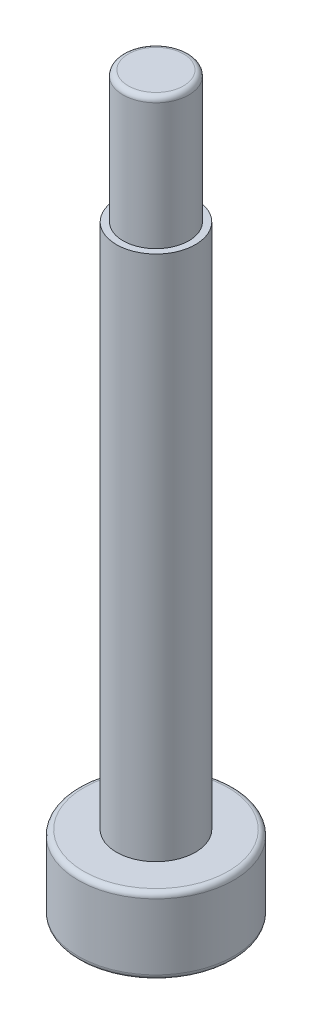
ISO-10303-21;
HEADER;
FILE_DESCRIPTION(('STEP AP214'),'2;1');
FILE_NAME('part.step','',(''),(''),'','','');
FILE_SCHEMA(('AUTOMOTIVE_DESIGN { 1 0 10303 214 1 1 1 1 }'));
ENDSEC;
DATA;
#1=APPLICATION_CONTEXT('core data for automotive mechanical design processes');
#2=APPLICATION_PROTOCOL_DEFINITION('international standard','automotive_design',2000,#1);
#3=PRODUCT_CONTEXT('',#1,'mechanical');
#4=PRODUCT('Part','Part','',(#3));
#5=PRODUCT_RELATED_PRODUCT_CATEGORY('part','',(#4));
#6=PRODUCT_DEFINITION_FORMATION('','',#4);
#7=PRODUCT_DEFINITION_CONTEXT('part definition',#1,'design');
#8=PRODUCT_DEFINITION('design','',#6,#7);
#9=PRODUCT_DEFINITION_SHAPE('','',#8);
#10=(LENGTH_UNIT() NAMED_UNIT(*) SI_UNIT(.MILLI.,.METRE.));
#11=(NAMED_UNIT(*) PLANE_ANGLE_UNIT() SI_UNIT($,.RADIAN.));
#12=(NAMED_UNIT(*) SI_UNIT($,.STERADIAN.) SOLID_ANGLE_UNIT());
#13=UNCERTAINTY_MEASURE_WITH_UNIT(LENGTH_MEASURE(1.E-05),#10,'distance_accuracy_value','');
#14=(GEOMETRIC_REPRESENTATION_CONTEXT(3) GLOBAL_UNCERTAINTY_ASSIGNED_CONTEXT((#13)) GLOBAL_UNIT_ASSIGNED_CONTEXT((#10,
#11,#12)) REPRESENTATION_CONTEXT('',''));
#15=CARTESIAN_POINT('',(0.,0.,0.));
#16=DIRECTION('',(0.,0.,1.));
#17=DIRECTION('',(1.,0.,0.));
#18=AXIS2_PLACEMENT_3D('',#15,#16,#17);
#19=CARTESIAN_POINT('',(0.,2.9,0.));
#20=DIRECTION('',(0.,-1.,0.));
#21=DIRECTION('',(0.,0.,-1.));
#22=AXIS2_PLACEMENT_3D('',#19,#20,#21);
#23=CYLINDRICAL_SURFACE('',#22,2.95);
#24=CARTESIAN_POINT('',(0.,0.2,0.));
#25=DIRECTION('',(0.,1.,0.));
#26=DIRECTION('',(0.,0.,1.));
#27=AXIS2_PLACEMENT_3D('',#24,#25,#26);
#28=CIRCLE('',#27,2.95);
#29=CARTESIAN_POINT('',(0.,0.2,2.95));
#30=VERTEX_POINT('',#29);
#31=EDGE_CURVE('E179',#30,#30,#28,.T.);
#32=ORIENTED_EDGE('',*,*,#31,.T.);
#33=EDGE_LOOP('',(#32));
#34=FACE_BOUND('',#33,.T.);
#35=CARTESIAN_POINT('',(0.,2.7,0.));
#36=DIRECTION('',(0.,1.,0.));
#37=DIRECTION('',(0.,0.,1.));
#38=AXIS2_PLACEMENT_3D('',#35,#36,#37);
#39=CIRCLE('',#38,2.95);
#40=CARTESIAN_POINT('',(0.,2.7,2.95));
#41=VERTEX_POINT('',#40);
#42=EDGE_CURVE('E168',#41,#41,#39,.F.);
#43=ORIENTED_EDGE('',*,*,#42,.T.);
#44=EDGE_LOOP('',(#43));
#45=FACE_BOUND('',#44,.T.);
#46=ADVANCED_FACE('F39',(#34,#45),#23,.T.);
#47=CARTESIAN_POINT('',(0.,2.9,0.));
#48=DIRECTION('',(0.,1.,0.));
#49=DIRECTION('',(0.,0.,1.));
#50=AXIS2_PLACEMENT_3D('',#47,#48,#49);
#51=PLANE('',#50);
#52=CARTESIAN_POINT('',(0.,2.9,0.));
#53=DIRECTION('',(0.,1.,0.));
#54=DIRECTION('',(0.,0.,1.));
#55=AXIS2_PLACEMENT_3D('',#52,#53,#54);
#56=CIRCLE('',#55,2.75);
#57=CARTESIAN_POINT('',(0.,2.9,2.75));
#58=VERTEX_POINT('',#57);
#59=EDGE_CURVE('E187',#58,#58,#56,.T.);
#60=ORIENTED_EDGE('',*,*,#59,.T.);
#61=EDGE_LOOP('',(#60));
#62=FACE_BOUND('',#61,.T.);
#63=CARTESIAN_POINT('',(0.,2.9,0.));
#64=DIRECTION('',(0.,1.,0.));
#65=DIRECTION('',(0.,0.,1.));
#66=AXIS2_PLACEMENT_3D('',#63,#64,#65);
#67=CIRCLE('',#66,1.5);
#68=CARTESIAN_POINT('',(0.,2.9,1.5));
#69=VERTEX_POINT('',#68);
#70=EDGE_CURVE('E169',#69,#69,#67,.T.);
#71=ORIENTED_EDGE('',*,*,#70,.F.);
#72=EDGE_LOOP('',(#71));
#73=FACE_BOUND('',#72,.T.);
#74=ADVANCED_FACE('F206',(#62,#73),#51,.T.);
#75=CARTESIAN_POINT('',(0.,0.,0.));
#76=DIRECTION('',(0.,1.,0.));
#77=DIRECTION('',(0.,0.,1.));
#78=AXIS2_PLACEMENT_3D('',#75,#76,#77);
#79=PLANE('',#78);
#80=CARTESIAN_POINT('',(0.,0.,0.));
#81=DIRECTION('',(0.,1.,0.));
#82=DIRECTION('',(0.,0.,1.));
#83=AXIS2_PLACEMENT_3D('',#80,#81,#82);
#84=CIRCLE('',#83,2.75);
#85=CARTESIAN_POINT('',(0.,0.,2.75));
#86=VERTEX_POINT('',#85);
#87=EDGE_CURVE('E183',#86,#86,#84,.F.);
#88=ORIENTED_EDGE('',*,*,#87,.T.);
#89=EDGE_LOOP('',(#88));
#90=FACE_BOUND('',#89,.T.);
#91=DIRECTION('',(-0.28704549437819,0.,0.95791695055322));
#92=VECTOR('',#91,1.);
#93=CARTESIAN_POINT('',(2.24728548800427,0.,-0.532016229770034));
#94=LINE('',#93,#92);
#95=CARTESIAN_POINT('',(2.24728548800427,0.,-0.532016229770034));
#96=VERTEX_POINT('',#95);
#97=CARTESIAN_POINT('',(1.58438231420861,0.,1.68019820728279));
#98=VERTEX_POINT('',#97);
#99=EDGE_CURVE('E135',#96,#98,#94,.T.);
#100=ORIENTED_EDGE('',*,*,#99,.F.);
#101=DIRECTION('',(0.686057666705715,0.,0.727547165449986));
#102=VECTOR('',#101,1.);
#103=CARTESIAN_POINT('',(0.662903173795668,0.,-2.21221443705283));
#104=LINE('',#103,#102);
#105=CARTESIAN_POINT('',(0.662903173795668,0.,-2.21221443705283));
#106=VERTEX_POINT('',#105);
#107=EDGE_CURVE('E55',#106,#96,#104,.T.);
#108=ORIENTED_EDGE('',*,*,#107,.F.);
#109=DIRECTION('',(0.973103161083906,0.,-0.230369785103234));
#110=VECTOR('',#109,1.);
#111=CARTESIAN_POINT('',(-1.58438231420861,0.,-1.68019820728279));
#112=LINE('',#111,#110);
#113=CARTESIAN_POINT('',(-1.58438231420861,0.,-1.68019820728279));
#114=VERTEX_POINT('',#113);
#115=EDGE_CURVE('E148',#114,#106,#112,.T.);
#116=ORIENTED_EDGE('',*,*,#115,.F.);
#117=DIRECTION('',(0.28704549437819,0.,-0.95791695055322));
#118=VECTOR('',#117,1.);
#119=CARTESIAN_POINT('',(-2.24728548800427,0.,0.532016229770034));
#120=LINE('',#119,#118);
#121=CARTESIAN_POINT('',(-2.24728548800427,0.,0.532016229770034));
#122=VERTEX_POINT('',#121);
#123=EDGE_CURVE('E145',#122,#114,#120,.T.);
#124=ORIENTED_EDGE('',*,*,#123,.F.);
#125=DIRECTION('',(-0.686057666705716,0.,-0.727547165449986));
#126=VECTOR('',#125,1.);
#127=CARTESIAN_POINT('',(-0.662903173795669,0.,2.21221443705283));
#128=LINE('',#127,#126);
#129=CARTESIAN_POINT('',(-0.662903173795669,0.,2.21221443705283));
#130=VERTEX_POINT('',#129);
#131=EDGE_CURVE('E103',#130,#122,#128,.T.);
#132=ORIENTED_EDGE('',*,*,#131,.F.);
#133=DIRECTION('',(-0.973103161083906,0.,0.230369785103234));
#134=VECTOR('',#133,1.);
#135=CARTESIAN_POINT('',(1.58438231420861,0.,1.68019820728279));
#136=LINE('',#135,#134);
#137=EDGE_CURVE('E139',#98,#130,#136,.T.);
#138=ORIENTED_EDGE('',*,*,#137,.F.);
#139=EDGE_LOOP('',(#100,#108,#116,#124,#132,#138));
#140=FACE_BOUND('',#139,.T.);
#141=ADVANCED_FACE('F212',(#90,#140),#79,.F.);
#142=CARTESIAN_POINT('',(0.,22.9,0.));
#143=DIRECTION('',(0.,-1.,0.));
#144=DIRECTION('',(0.,0.,-1.));
#145=AXIS2_PLACEMENT_3D('',#142,#143,#144);
#146=CYLINDRICAL_SURFACE('',#145,1.5);
#147=CARTESIAN_POINT('',(0.,22.9,0.));
#148=DIRECTION('',(0.,1.,0.));
#149=DIRECTION('',(0.,0.,1.));
#150=AXIS2_PLACEMENT_3D('',#147,#148,#149);
#151=CIRCLE('',#150,1.5);
#152=CARTESIAN_POINT('',(0.,22.9,1.5));
#153=VERTEX_POINT('',#152);
#154=EDGE_CURVE('E154',#153,#153,#151,.T.);
#155=ORIENTED_EDGE('',*,*,#154,.F.);
#156=EDGE_LOOP('',(#155));
#157=FACE_BOUND('',#156,.T.);
#158=ORIENTED_EDGE('',*,*,#70,.T.);
#159=EDGE_LOOP('',(#158));
#160=FACE_BOUND('',#159,.T.);
#161=ADVANCED_FACE('F231',(#157,#160),#146,.T.);
#162=CARTESIAN_POINT('',(0.,22.9,0.));
#163=DIRECTION('',(0.,1.,0.));
#164=DIRECTION('',(0.,0.,1.));
#165=AXIS2_PLACEMENT_3D('',#162,#163,#164);
#166=PLANE('',#165);
#167=CARTESIAN_POINT('',(0.,22.9,0.));
#168=DIRECTION('',(0.,1.,0.));
#169=DIRECTION('',(0.,0.,1.));
#170=AXIS2_PLACEMENT_3D('',#167,#168,#169);
#171=CIRCLE('',#170,1.25);
#172=CARTESIAN_POINT('',(0.,22.9,1.25));
#173=VERTEX_POINT('',#172);
#174=EDGE_CURVE('E164',#173,#173,#171,.T.);
#175=ORIENTED_EDGE('',*,*,#174,.F.);
#176=EDGE_LOOP('',(#175));
#177=FACE_BOUND('',#176,.T.);
#178=ORIENTED_EDGE('',*,*,#154,.T.);
#179=EDGE_LOOP('',(#178));
#180=FACE_BOUND('',#179,.T.);
#181=ADVANCED_FACE('F255',(#177,#180),#166,.T.);
#182=CARTESIAN_POINT('',(0.,27.9,0.));
#183=DIRECTION('',(0.,-1.,0.));
#184=DIRECTION('',(0.,0.,-1.));
#185=AXIS2_PLACEMENT_3D('',#182,#183,#184);
#186=CYLINDRICAL_SURFACE('',#185,1.25);
#187=CARTESIAN_POINT('',(0.,27.7,0.));
#188=DIRECTION('',(0.,1.,0.));
#189=DIRECTION('',(0.,0.,1.));
#190=AXIS2_PLACEMENT_3D('',#187,#188,#189);
#191=CIRCLE('',#190,1.25);
#192=CARTESIAN_POINT('',(0.,27.7,1.25));
#193=VERTEX_POINT('',#192);
#194=EDGE_CURVE('E11',#193,#193,#191,.F.);
#195=ORIENTED_EDGE('',*,*,#194,.T.);
#196=EDGE_LOOP('',(#195));
#197=FACE_BOUND('',#196,.T.);
#198=ORIENTED_EDGE('',*,*,#174,.T.);
#199=EDGE_LOOP('',(#198));
#200=FACE_BOUND('',#199,.T.);
#201=ADVANCED_FACE('F248',(#197,#200),#186,.T.);
#202=CARTESIAN_POINT('',(0.,27.9,0.));
#203=DIRECTION('',(0.,1.,0.));
#204=DIRECTION('',(0.,0.,1.));
#205=AXIS2_PLACEMENT_3D('',#202,#203,#204);
#206=PLANE('',#205);
#207=CARTESIAN_POINT('',(0.,27.9,0.));
#208=DIRECTION('',(0.,1.,0.));
#209=DIRECTION('',(0.,0.,1.));
#210=AXIS2_PLACEMENT_3D('',#207,#208,#209);
#211=CIRCLE('',#210,1.05);
#212=CARTESIAN_POINT('',(0.,27.9,1.05));
#213=VERTEX_POINT('',#212);
#214=EDGE_CURVE('E48',#213,#213,#211,.T.);
#215=ORIENTED_EDGE('',*,*,#214,.T.);
#216=EDGE_LOOP('',(#215));
#217=FACE_BOUND('',#216,.T.);
#218=ADVANCED_FACE('F194',(#217),#206,.T.);
#219=CARTESIAN_POINT('',(0.662903173795668,2.,-2.21221443705283));
#220=DIRECTION('',(0.727547165449986,0.,-0.686057666705715));
#221=DIRECTION('',(-0.686057666705716,0.,-0.727547165449986));
#222=AXIS2_PLACEMENT_3D('',#219,#220,#221);
#223=PLANE('',#222);
#224=ORIENTED_EDGE('',*,*,#107,.T.);
#225=DIRECTION('',(0.,-1.,0.));
#226=VECTOR('',#225,1.);
#227=CARTESIAN_POINT('',(2.24728548800427,2.,-0.532016229770034));
#228=LINE('',#227,#226);
#229=CARTESIAN_POINT('',(2.24728548800427,2.,-0.532016229770034));
#230=VERTEX_POINT('',#229);
#231=EDGE_CURVE('E85',#230,#96,#228,.T.);
#232=ORIENTED_EDGE('',*,*,#231,.F.);
#233=DIRECTION('',(0.686057666705715,0.,0.727547165449986));
#234=VECTOR('',#233,1.);
#235=CARTESIAN_POINT('',(0.662903173795668,2.,-2.21221443705283));
#236=LINE('',#235,#234);
#237=CARTESIAN_POINT('',(0.662903173795668,2.,-2.21221443705283));
#238=VERTEX_POINT('',#237);
#239=EDGE_CURVE('E151',#238,#230,#236,.T.);
#240=ORIENTED_EDGE('',*,*,#239,.F.);
#241=DIRECTION('',(0.,-1.,0.));
#242=VECTOR('',#241,1.);
#243=CARTESIAN_POINT('',(0.662903173795668,2.,-2.21221443705283));
#244=LINE('',#243,#242);
#245=EDGE_CURVE('E63',#238,#106,#244,.T.);
#246=ORIENTED_EDGE('',*,*,#245,.T.);
#247=EDGE_LOOP('',(#224,#232,#240,#246));
#248=FACE_BOUND('',#247,.T.);
#249=ADVANCED_FACE('F239',(#248),#223,.F.);
#250=CARTESIAN_POINT('',(-1.58438231420861,2.,-1.68019820728279));
#251=DIRECTION('',(-0.230369785103234,0.,-0.973103161083906));
#252=DIRECTION('',(-0.973103161083906,0.,0.230369785103234));
#253=AXIS2_PLACEMENT_3D('',#250,#251,#252);
#254=PLANE('',#253);
#255=ORIENTED_EDGE('',*,*,#115,.T.);
#256=ORIENTED_EDGE('',*,*,#245,.F.);
#257=DIRECTION('',(0.973103161083906,0.,-0.230369785103234));
#258=VECTOR('',#257,1.);
#259=CARTESIAN_POINT('',(-1.58438231420861,2.,-1.68019820728279));
#260=LINE('',#259,#258);
#261=CARTESIAN_POINT('',(-1.58438231420861,2.,-1.68019820728279));
#262=VERTEX_POINT('',#261);
#263=EDGE_CURVE('E117',#262,#238,#260,.T.);
#264=ORIENTED_EDGE('',*,*,#263,.F.);
#265=DIRECTION('',(0.,-1.,0.));
#266=VECTOR('',#265,1.);
#267=CARTESIAN_POINT('',(-1.58438231420861,2.,-1.68019820728279));
#268=LINE('',#267,#266);
#269=EDGE_CURVE('E108',#262,#114,#268,.T.);
#270=ORIENTED_EDGE('',*,*,#269,.T.);
#271=EDGE_LOOP('',(#255,#256,#264,#270));
#272=FACE_BOUND('',#271,.T.);
#273=ADVANCED_FACE('F241',(#272),#254,.F.);
#274=CARTESIAN_POINT('',(-2.24728548800427,2.,0.532016229770034));
#275=DIRECTION('',(-0.95791695055322,0.,-0.28704549437819));
#276=DIRECTION('',(-0.28704549437819,0.,0.95791695055322));
#277=AXIS2_PLACEMENT_3D('',#274,#275,#276);
#278=PLANE('',#277);
#279=ORIENTED_EDGE('',*,*,#123,.T.);
#280=ORIENTED_EDGE('',*,*,#269,.F.);
#281=DIRECTION('',(0.28704549437819,0.,-0.95791695055322));
#282=VECTOR('',#281,1.);
#283=CARTESIAN_POINT('',(-2.24728548800427,2.,0.532016229770034));
#284=LINE('',#283,#282);
#285=CARTESIAN_POINT('',(-2.24728548800427,2.,0.532016229770034));
#286=VERTEX_POINT('',#285);
#287=EDGE_CURVE('E112',#286,#262,#284,.T.);
#288=ORIENTED_EDGE('',*,*,#287,.F.);
#289=DIRECTION('',(0.,-1.,0.));
#290=VECTOR('',#289,1.);
#291=CARTESIAN_POINT('',(-2.24728548800427,2.,0.532016229770034));
#292=LINE('',#291,#290);
#293=EDGE_CURVE('E96',#286,#122,#292,.T.);
#294=ORIENTED_EDGE('',*,*,#293,.T.);
#295=EDGE_LOOP('',(#279,#280,#288,#294));
#296=FACE_BOUND('',#295,.T.);
#297=ADVANCED_FACE('F113',(#296),#278,.F.);
#298=CARTESIAN_POINT('',(-0.662903173795669,2.,2.21221443705283));
#299=DIRECTION('',(-0.727547165449986,0.,0.686057666705716));
#300=DIRECTION('',(0.686057666705716,0.,0.727547165449986));
#301=AXIS2_PLACEMENT_3D('',#298,#299,#300);
#302=PLANE('',#301);
#303=ORIENTED_EDGE('',*,*,#131,.T.);
#304=ORIENTED_EDGE('',*,*,#293,.F.);
#305=DIRECTION('',(-0.686057666705716,0.,-0.727547165449986));
#306=VECTOR('',#305,1.);
#307=CARTESIAN_POINT('',(-0.662903173795669,2.,2.21221443705283));
#308=LINE('',#307,#306);
#309=CARTESIAN_POINT('',(-0.662903173795669,2.,2.21221443705283));
#310=VERTEX_POINT('',#309);
#311=EDGE_CURVE('E100',#310,#286,#308,.T.);
#312=ORIENTED_EDGE('',*,*,#311,.F.);
#313=DIRECTION('',(0.,-1.,0.));
#314=VECTOR('',#313,1.);
#315=CARTESIAN_POINT('',(-0.662903173795669,2.,2.21221443705283));
#316=LINE('',#315,#314);
#317=EDGE_CURVE('E109',#310,#130,#316,.T.);
#318=ORIENTED_EDGE('',*,*,#317,.T.);
#319=EDGE_LOOP('',(#303,#304,#312,#318));
#320=FACE_BOUND('',#319,.T.);
#321=ADVANCED_FACE('F98',(#320),#302,.F.);
#322=CARTESIAN_POINT('',(1.58438231420861,2.,1.68019820728279));
#323=DIRECTION('',(0.230369785103234,0.,0.973103161083906));
#324=DIRECTION('',(0.973103161083906,0.,-0.230369785103234));
#325=AXIS2_PLACEMENT_3D('',#322,#323,#324);
#326=PLANE('',#325);
#327=ORIENTED_EDGE('',*,*,#137,.T.);
#328=ORIENTED_EDGE('',*,*,#317,.F.);
#329=DIRECTION('',(-0.973103161083906,0.,0.230369785103234));
#330=VECTOR('',#329,1.);
#331=CARTESIAN_POINT('',(1.58438231420861,2.,1.68019820728279));
#332=LINE('',#331,#330);
#333=CARTESIAN_POINT('',(1.58438231420861,2.,1.68019820728279));
#334=VERTEX_POINT('',#333);
#335=EDGE_CURVE('E123',#334,#310,#332,.T.);
#336=ORIENTED_EDGE('',*,*,#335,.F.);
#337=DIRECTION('',(0.,-1.,0.));
#338=VECTOR('',#337,1.);
#339=CARTESIAN_POINT('',(1.58438231420861,2.,1.68019820728279));
#340=LINE('',#339,#338);
#341=EDGE_CURVE('E159',#334,#98,#340,.T.);
#342=ORIENTED_EDGE('',*,*,#341,.T.);
#343=EDGE_LOOP('',(#327,#328,#336,#342));
#344=FACE_BOUND('',#343,.T.);
#345=ADVANCED_FACE('F313',(#344),#326,.F.);
#346=CARTESIAN_POINT('',(2.24728548800427,2.,-0.532016229770034));
#347=DIRECTION('',(0.95791695055322,0.,0.28704549437819));
#348=DIRECTION('',(0.28704549437819,0.,-0.95791695055322));
#349=AXIS2_PLACEMENT_3D('',#346,#347,#348);
#350=PLANE('',#349);
#351=ORIENTED_EDGE('',*,*,#99,.T.);
#352=ORIENTED_EDGE('',*,*,#341,.F.);
#353=DIRECTION('',(-0.28704549437819,0.,0.95791695055322));
#354=VECTOR('',#353,1.);
#355=CARTESIAN_POINT('',(2.24728548800427,2.,-0.532016229770034));
#356=LINE('',#355,#354);
#357=EDGE_CURVE('E127',#230,#334,#356,.T.);
#358=ORIENTED_EDGE('',*,*,#357,.F.);
#359=ORIENTED_EDGE('',*,*,#231,.T.);
#360=EDGE_LOOP('',(#351,#352,#358,#359));
#361=FACE_BOUND('',#360,.T.);
#362=ADVANCED_FACE('F223',(#361),#350,.F.);
#363=CARTESIAN_POINT('',(0.,2.,0.));
#364=DIRECTION('',(0.,-1.,0.));
#365=DIRECTION('',(0.,0.,-1.));
#366=AXIS2_PLACEMENT_3D('',#363,#364,#365);
#367=PLANE('',#366);
#368=ORIENTED_EDGE('',*,*,#239,.T.);
#369=ORIENTED_EDGE('',*,*,#357,.T.);
#370=ORIENTED_EDGE('',*,*,#335,.T.);
#371=ORIENTED_EDGE('',*,*,#311,.T.);
#372=ORIENTED_EDGE('',*,*,#287,.T.);
#373=ORIENTED_EDGE('',*,*,#263,.T.);
#374=EDGE_LOOP('',(#368,#369,#370,#371,#372,#373));
#375=FACE_BOUND('',#374,.T.);
#376=ADVANCED_FACE('F120',(#375),#367,.T.);
#377=CARTESIAN_POINT('',(0.,0.2,0.));
#378=DIRECTION('',(0.,1.,0.));
#379=DIRECTION('',(0.,0.,1.));
#380=AXIS2_PLACEMENT_3D('',#377,#378,#379);
#381=TOROIDAL_SURFACE('',#380,2.75,0.2);
#382=ORIENTED_EDGE('',*,*,#87,.F.);
#383=EDGE_LOOP('',(#382));
#384=FACE_BOUND('',#383,.T.);
#385=ORIENTED_EDGE('',*,*,#31,.F.);
#386=EDGE_LOOP('',(#385));
#387=FACE_BOUND('',#386,.T.);
#388=ADVANCED_FACE('F202',(#384,#387),#381,.T.);
#389=CARTESIAN_POINT('',(0.,2.7,0.));
#390=DIRECTION('',(0.,1.,0.));
#391=DIRECTION('',(0.,0.,1.));
#392=AXIS2_PLACEMENT_3D('',#389,#390,#391);
#393=TOROIDAL_SURFACE('',#392,2.75,0.2);
#394=ORIENTED_EDGE('',*,*,#42,.F.);
#395=EDGE_LOOP('',(#394));
#396=FACE_BOUND('',#395,.T.);
#397=ORIENTED_EDGE('',*,*,#59,.F.);
#398=EDGE_LOOP('',(#397));
#399=FACE_BOUND('',#398,.T.);
#400=ADVANCED_FACE('F197',(#396,#399),#393,.T.);
#401=CARTESIAN_POINT('',(0.,27.7,0.));
#402=DIRECTION('',(0.,1.,0.));
#403=DIRECTION('',(0.,0.,1.));
#404=AXIS2_PLACEMENT_3D('',#401,#402,#403);
#405=TOROIDAL_SURFACE('',#404,1.05,0.2);
#406=ORIENTED_EDGE('',*,*,#194,.F.);
#407=EDGE_LOOP('',(#406));
#408=FACE_BOUND('',#407,.T.);
#409=ORIENTED_EDGE('',*,*,#214,.F.);
#410=EDGE_LOOP('',(#409));
#411=FACE_BOUND('',#410,.T.);
#412=ADVANCED_FACE('F41',(#408,#411),#405,.T.);
#413=CLOSED_SHELL('',(#46,#74,#141,#161,#181,#201,#218,#249,#273,#297,#321,#345,#362,#376,#388,
#400,#412));
#414=MANIFOLD_SOLID_BREP('B2',#413);
#415=ADVANCED_BREP_SHAPE_REPRESENTATION('',(#18,#414),#14);
#416=SHAPE_DEFINITION_REPRESENTATION(#9,#415);
ENDSEC;
END-ISO-10303-21;
